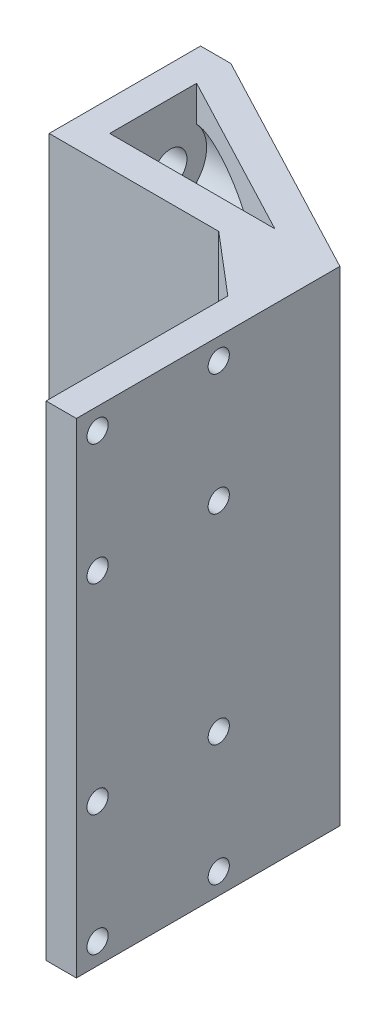
ISO-10303-21;
HEADER;
FILE_DESCRIPTION(('STEP AP214'),'2;1');
FILE_NAME('part.step','',(''),(''),'','','');
FILE_SCHEMA(('AUTOMOTIVE_DESIGN { 1 0 10303 214 1 1 1 1 }'));
ENDSEC;
DATA;
#1=APPLICATION_CONTEXT('core data for automotive mechanical design processes');
#2=APPLICATION_PROTOCOL_DEFINITION('international standard','automotive_design',2000,#1);
#3=PRODUCT_CONTEXT('',#1,'mechanical');
#4=PRODUCT('Part','Part','',(#3));
#5=PRODUCT_RELATED_PRODUCT_CATEGORY('part','',(#4));
#6=PRODUCT_DEFINITION_FORMATION('','',#4);
#7=PRODUCT_DEFINITION_CONTEXT('part definition',#1,'design');
#8=PRODUCT_DEFINITION('design','',#6,#7);
#9=PRODUCT_DEFINITION_SHAPE('','',#8);
#10=(LENGTH_UNIT() NAMED_UNIT(*) SI_UNIT(.MILLI.,.METRE.));
#11=(NAMED_UNIT(*) PLANE_ANGLE_UNIT() SI_UNIT($,.RADIAN.));
#12=(NAMED_UNIT(*) SI_UNIT($,.STERADIAN.) SOLID_ANGLE_UNIT());
#13=UNCERTAINTY_MEASURE_WITH_UNIT(LENGTH_MEASURE(1.E-05),#10,'distance_accuracy_value','');
#14=(GEOMETRIC_REPRESENTATION_CONTEXT(3) GLOBAL_UNCERTAINTY_ASSIGNED_CONTEXT((#13)) GLOBAL_UNIT_ASSIGNED_CONTEXT((#10,
#11,#12)) REPRESENTATION_CONTEXT('',''));
#15=CARTESIAN_POINT('',(0.,0.,0.));
#16=DIRECTION('',(0.,0.,1.));
#17=DIRECTION('',(1.,0.,0.));
#18=AXIS2_PLACEMENT_3D('',#15,#16,#17);
#19=CARTESIAN_POINT('',(-28.3968723584108,-98.5901727555194,-14.3497603806358));
#20=DIRECTION('',(-0.465746432832622,0.,0.884918222381982));
#21=DIRECTION('',(0.884918222381982,0.,0.465746432832622));
#22=AXIS2_PLACEMENT_3D('',#19,#20,#21);
#23=PLANE('',#22);
#24=DIRECTION('',(0.,1.,0.));
#25=VECTOR('',#24,1.);
#26=CARTESIAN_POINT('',(-28.3968723584108,-98.5901727555194,-14.3497603806358));
#27=LINE('',#26,#25);
#28=CARTESIAN_POINT('',(-28.3968723584108,-41.5156062374836,-14.3497603806358));
#29=VERTEX_POINT('',#28);
#30=CARTESIAN_POINT('',(-28.3968723584108,-29.7810970592197,-14.3497603806358));
#31=VERTEX_POINT('',#30);
#32=EDGE_CURVE('E163',#29,#31,#27,.T.);
#33=ORIENTED_EDGE('',*,*,#32,.F.);
#34=CARTESIAN_POINT('',(-20.1323276352027,-45.6483516483516,-10.));
#35=DIRECTION('',(-0.465746432832622,0.,0.884918222381982));
#36=DIRECTION('',(-0.884918222381983,0.,-0.465746432832622));
#37=AXIS2_PLACEMENT_3D('',#34,#35,#36);
#38=ELLIPSE('',#37,12.8825463321503,6.);
#39=CARTESIAN_POINT('',(-28.3968723584108,-49.7810970592197,-14.3497603806358));
#40=VERTEX_POINT('',#39);
#41=EDGE_CURVE('E150',#40,#29,#38,.T.);
#42=ORIENTED_EDGE('',*,*,#41,.F.);
#43=CARTESIAN_POINT('',(-28.3968723584108,-55.6483516483516,-14.3497603806358));
#44=VERTEX_POINT('',#43);
#45=EDGE_CURVE('E160',#44,#40,#27,.T.);
#46=ORIENTED_EDGE('',*,*,#45,.F.);
#47=DIRECTION('',(-0.884918222381982,0.,-0.465746432832622));
#48=VECTOR('',#47,1.);
#49=CARTESIAN_POINT('',(-28.3968723584108,-55.6483516483516,-14.3497603806358));
#50=LINE('',#49,#48);
#51=CARTESIAN_POINT('',(-1.13232763520272,-55.6483516483516,0.));
#52=VERTEX_POINT('',#51);
#53=EDGE_CURVE('E177',#52,#44,#50,.T.);
#54=ORIENTED_EDGE('',*,*,#53,.F.);
#55=DIRECTION('',(0.,1.,0.));
#56=VECTOR('',#55,1.);
#57=CARTESIAN_POINT('',(-1.13232763520273,-98.5901727555194,0.));
#58=LINE('',#57,#56);
#59=CARTESIAN_POINT('',(-1.13232763520274,24.3516483516484,0.));
#60=VERTEX_POINT('',#59);
#61=EDGE_CURVE('E171',#52,#60,#58,.T.);
#62=ORIENTED_EDGE('',*,*,#61,.T.);
#63=DIRECTION('',(0.884918222381982,0.,0.465746432832622));
#64=VECTOR('',#63,1.);
#65=CARTESIAN_POINT('',(-28.3968723584108,24.3516483516484,-14.3497603806358));
#66=LINE('',#65,#64);
#67=CARTESIAN_POINT('',(-28.3968723584108,24.3516483516484,-14.3497603806358));
#68=VERTEX_POINT('',#67);
#69=EDGE_CURVE('E183',#68,#60,#66,.T.);
#70=ORIENTED_EDGE('',*,*,#69,.F.);
#71=CARTESIAN_POINT('',(-28.3968723584108,18.4843937625164,-14.3497603806358));
#72=VERTEX_POINT('',#71);
#73=EDGE_CURVE('E173',#72,#68,#27,.T.);
#74=ORIENTED_EDGE('',*,*,#73,.F.);
#75=CARTESIAN_POINT('',(-20.1323276352027,14.3516483516484,-10.));
#76=DIRECTION('',(-0.465746432832622,0.,0.884918222381982));
#77=DIRECTION('',(-0.884918222381983,0.,-0.465746432832622));
#78=AXIS2_PLACEMENT_3D('',#75,#76,#77);
#79=ELLIPSE('',#78,12.8825463321503,6.);
#80=CARTESIAN_POINT('',(-28.3968723584108,10.2189029407803,-14.3497603806358));
#81=VERTEX_POINT('',#80);
#82=EDGE_CURVE('E210',#81,#72,#79,.T.);
#83=ORIENTED_EDGE('',*,*,#82,.F.);
#84=CARTESIAN_POINT('',(-28.3968723584108,-1.51560623748359,-14.3497603806358));
#85=VERTEX_POINT('',#84);
#86=EDGE_CURVE('E182',#85,#81,#27,.T.);
#87=ORIENTED_EDGE('',*,*,#86,.F.);
#88=CARTESIAN_POINT('',(-20.1323276352027,-5.64835164835165,-10.));
#89=DIRECTION('',(-0.465746432832622,0.,0.884918222381982));
#90=DIRECTION('',(-0.884918222381983,0.,-0.465746432832622));
#91=AXIS2_PLACEMENT_3D('',#88,#89,#90);
#92=ELLIPSE('',#91,12.8825463321503,6.);
#93=CARTESIAN_POINT('',(-28.3968723584108,-9.7810970592197,-14.3497603806358));
#94=VERTEX_POINT('',#93);
#95=EDGE_CURVE('E206',#94,#85,#92,.T.);
#96=ORIENTED_EDGE('',*,*,#95,.F.);
#97=CARTESIAN_POINT('',(-28.3968723584108,-21.5156062374836,-14.3497603806358));
#98=VERTEX_POINT('',#97);
#99=EDGE_CURVE('E179',#98,#94,#27,.T.);
#100=ORIENTED_EDGE('',*,*,#99,.F.);
#101=CARTESIAN_POINT('',(-20.1323276352027,-25.6483516483516,-10.));
#102=DIRECTION('',(-0.465746432832622,0.,0.884918222381982));
#103=DIRECTION('',(-0.884918222381983,0.,-0.465746432832622));
#104=AXIS2_PLACEMENT_3D('',#101,#102,#103);
#105=ELLIPSE('',#104,12.8825463321503,6.);
#106=EDGE_CURVE('E217',#31,#98,#105,.T.);
#107=ORIENTED_EDGE('',*,*,#106,.F.);
#108=EDGE_LOOP('',(#33,#42,#46,#54,#62,#70,#74,#83,#87,#96,#100,#107));
#109=FACE_BOUND('',#108,.T.);
#110=ADVANCED_FACE('F41',(#109),#23,.T.);
#111=CARTESIAN_POINT('',(0.,0.,0.));
#112=DIRECTION('',(0.,0.,1.));
#113=DIRECTION('',(1.,0.,0.));
#114=AXIS2_PLACEMENT_3D('',#111,#112,#113);
#115=PLANE('',#114);
#116=CARTESIAN_POINT('',(-18.3968723584108,-45.6483516483517,0.));
#117=DIRECTION('',(0.,0.,-1.));
#118=DIRECTION('',(-1.,0.,0.));
#119=AXIS2_PLACEMENT_3D('',#116,#117,#118);
#120=CIRCLE('',#119,1.5);
#121=CARTESIAN_POINT('',(-19.8968723584108,-45.6483516483517,0.));
#122=VERTEX_POINT('',#121);
#123=EDGE_CURVE('E434',#122,#122,#120,.T.);
#124=ORIENTED_EDGE('',*,*,#123,.F.);
#125=EDGE_LOOP('',(#124));
#126=FACE_BOUND('',#125,.T.);
#127=DIRECTION('',(-1.,0.,0.));
#128=VECTOR('',#127,1.);
#129=CARTESIAN_POINT('',(-33.3968723584108,24.3516483516484,0.));
#130=LINE('',#129,#128);
#131=CARTESIAN_POINT('',(-28.3968723584108,24.3516483516484,0.));
#132=VERTEX_POINT('',#131);
#133=EDGE_CURVE('E379',#60,#132,#130,.T.);
#134=ORIENTED_EDGE('',*,*,#133,.F.);
#135=ORIENTED_EDGE('',*,*,#61,.F.);
#136=DIRECTION('',(1.,0.,0.));
#137=VECTOR('',#136,1.);
#138=CARTESIAN_POINT('',(-33.3968723584108,-55.6483516483516,0.));
#139=LINE('',#138,#137);
#140=CARTESIAN_POINT('',(-28.3968723584108,-55.6483516483516,0.));
#141=VERTEX_POINT('',#140);
#142=EDGE_CURVE('E371',#141,#52,#139,.T.);
#143=ORIENTED_EDGE('',*,*,#142,.F.);
#144=DIRECTION('',(0.,-1.,0.));
#145=VECTOR('',#144,1.);
#146=CARTESIAN_POINT('',(-28.3968723584108,-55.6483516483516,0.));
#147=LINE('',#146,#145);
#148=EDGE_CURVE('E280',#132,#141,#147,.T.);
#149=ORIENTED_EDGE('',*,*,#148,.F.);
#150=EDGE_LOOP('',(#134,#135,#143,#149));
#151=FACE_BOUND('',#150,.T.);
#152=ADVANCED_FACE('F465',(#126,#151),#115,.F.);
#153=CARTESIAN_POINT('',(0.,0.,5.));
#154=DIRECTION('',(0.,0.,1.));
#155=DIRECTION('',(1.,0.,0.));
#156=AXIS2_PLACEMENT_3D('',#153,#154,#155);
#157=PLANE('',#156);
#158=CARTESIAN_POINT('',(-18.3968723584108,-45.6483516483517,5.));
#159=DIRECTION('',(0.,0.,1.));
#160=DIRECTION('',(1.,0.,0.));
#161=AXIS2_PLACEMENT_3D('',#158,#159,#160);
#162=CIRCLE('',#161,1.5);
#163=CARTESIAN_POINT('',(-16.8968723584108,-45.6483516483517,5.));
#164=VERTEX_POINT('',#163);
#165=EDGE_CURVE('E258',#164,#164,#162,.F.);
#166=ORIENTED_EDGE('',*,*,#165,.T.);
#167=EDGE_LOOP('',(#166));
#168=FACE_BOUND('',#167,.T.);
#169=DIRECTION('',(1.,0.,0.));
#170=VECTOR('',#169,1.);
#171=CARTESIAN_POINT('',(-33.3968723584108,-55.6483516483516,5.));
#172=LINE('',#171,#170);
#173=CARTESIAN_POINT('',(-33.3968723584108,-55.6483516483516,5.));
#174=VERTEX_POINT('',#173);
#175=CARTESIAN_POINT('',(-5.39687235841076,-55.6483516483516,5.));
#176=VERTEX_POINT('',#175);
#177=EDGE_CURVE('E378',#174,#176,#172,.T.);
#178=ORIENTED_EDGE('',*,*,#177,.T.);
#179=DIRECTION('',(0.,1.,0.));
#180=VECTOR('',#179,1.);
#181=CARTESIAN_POINT('',(-5.39687235841076,24.3516483516484,5.));
#182=LINE('',#181,#180);
#183=CARTESIAN_POINT('',(-5.39687235841076,24.3516483516484,5.));
#184=VERTEX_POINT('',#183);
#185=EDGE_CURVE('E405',#176,#184,#182,.T.);
#186=ORIENTED_EDGE('',*,*,#185,.T.);
#187=DIRECTION('',(-1.,0.,0.));
#188=VECTOR('',#187,1.);
#189=CARTESIAN_POINT('',(-33.3968723584108,24.3516483516484,5.));
#190=LINE('',#189,#188);
#191=CARTESIAN_POINT('',(-33.3968723584108,24.3516483516484,5.));
#192=VERTEX_POINT('',#191);
#193=EDGE_CURVE('E383',#184,#192,#190,.T.);
#194=ORIENTED_EDGE('',*,*,#193,.T.);
#195=DIRECTION('',(0.,-1.,0.));
#196=VECTOR('',#195,1.);
#197=CARTESIAN_POINT('',(-33.3968723584108,24.3516483516484,5.));
#198=LINE('',#197,#196);
#199=EDGE_CURVE('E374',#192,#174,#198,.T.);
#200=ORIENTED_EDGE('',*,*,#199,.T.);
#201=EDGE_LOOP('',(#178,#186,#194,#200));
#202=FACE_BOUND('',#201,.T.);
#203=ADVANCED_FACE('F413',(#168,#202),#157,.T.);
#204=CARTESIAN_POINT('',(-33.3968723584108,24.3516483516484,5.));
#205=DIRECTION('',(1.,0.,0.));
#206=DIRECTION('',(0.,0.,-1.));
#207=AXIS2_PLACEMENT_3D('',#204,#205,#206);
#208=PLANE('',#207);
#209=CARTESIAN_POINT('',(-33.3968723584108,14.3516483516484,-10.));
#210=DIRECTION('',(1.,0.,0.));
#211=DIRECTION('',(0.,0.,-1.));
#212=AXIS2_PLACEMENT_3D('',#209,#210,#211);
#213=CIRCLE('',#212,2.75);
#214=CARTESIAN_POINT('',(-33.3968723584108,14.3516483516484,-12.75));
#215=VERTEX_POINT('',#214);
#216=EDGE_CURVE('E283',#215,#215,#213,.F.);
#217=ORIENTED_EDGE('',*,*,#216,.F.);
#218=EDGE_LOOP('',(#217));
#219=FACE_BOUND('',#218,.T.);
#220=CARTESIAN_POINT('',(-33.3968723584108,-5.64835164835165,-10.));
#221=DIRECTION('',(1.,0.,0.));
#222=DIRECTION('',(0.,0.,-1.));
#223=AXIS2_PLACEMENT_3D('',#220,#221,#222);
#224=CIRCLE('',#223,2.75);
#225=CARTESIAN_POINT('',(-33.3968723584108,-5.64835164835165,-12.75));
#226=VERTEX_POINT('',#225);
#227=EDGE_CURVE('E443',#226,#226,#224,.F.);
#228=ORIENTED_EDGE('',*,*,#227,.F.);
#229=EDGE_LOOP('',(#228));
#230=FACE_BOUND('',#229,.T.);
#231=CARTESIAN_POINT('',(-33.3968723584108,-25.6483516483516,-10.));
#232=DIRECTION('',(1.,0.,0.));
#233=DIRECTION('',(0.,0.,-1.));
#234=AXIS2_PLACEMENT_3D('',#231,#232,#233);
#235=CIRCLE('',#234,2.75);
#236=CARTESIAN_POINT('',(-33.3968723584108,-25.6483516483516,-12.75));
#237=VERTEX_POINT('',#236);
#238=EDGE_CURVE('E435',#237,#237,#235,.F.);
#239=ORIENTED_EDGE('',*,*,#238,.F.);
#240=EDGE_LOOP('',(#239));
#241=FACE_BOUND('',#240,.T.);
#242=CARTESIAN_POINT('',(-33.3968723584108,-45.6483516483516,-10.));
#243=DIRECTION('',(1.,0.,0.));
#244=DIRECTION('',(0.,0.,-1.));
#245=AXIS2_PLACEMENT_3D('',#242,#243,#244);
#246=CIRCLE('',#245,2.75);
#247=CARTESIAN_POINT('',(-33.3968723584108,-45.6483516483516,-12.75));
#248=VERTEX_POINT('',#247);
#249=EDGE_CURVE('E425',#248,#248,#246,.F.);
#250=ORIENTED_EDGE('',*,*,#249,.F.);
#251=EDGE_LOOP('',(#250));
#252=FACE_BOUND('',#251,.T.);
#253=DIRECTION('',(0.,0.,-1.));
#254=VECTOR('',#253,1.);
#255=CARTESIAN_POINT('',(-33.3968723584108,24.3516483516484,5.));
#256=LINE('',#255,#254);
#257=CARTESIAN_POINT('',(-33.3968723584108,24.3516483516484,-20.));
#258=VERTEX_POINT('',#257);
#259=EDGE_CURVE('E386',#192,#258,#256,.T.);
#260=ORIENTED_EDGE('',*,*,#259,.T.);
#261=DIRECTION('',(0.,1.,0.));
#262=VECTOR('',#261,1.);
#263=CARTESIAN_POINT('',(-33.3968723584108,-55.6483516483516,-20.));
#264=LINE('',#263,#262);
#265=CARTESIAN_POINT('',(-33.3968723584108,-55.6483516483516,-20.));
#266=VERTEX_POINT('',#265);
#267=EDGE_CURVE('E282',#266,#258,#264,.T.);
#268=ORIENTED_EDGE('',*,*,#267,.F.);
#269=DIRECTION('',(0.,0.,-1.));
#270=VECTOR('',#269,1.);
#271=CARTESIAN_POINT('',(-33.3968723584108,-55.6483516483516,5.));
#272=LINE('',#271,#270);
#273=EDGE_CURVE('E272',#174,#266,#272,.T.);
#274=ORIENTED_EDGE('',*,*,#273,.F.);
#275=ORIENTED_EDGE('',*,*,#199,.F.);
#276=EDGE_LOOP('',(#260,#268,#274,#275));
#277=FACE_BOUND('',#276,.T.);
#278=ADVANCED_FACE('F420',(#219,#230,#241,#252,#277),#208,.F.);
#279=CARTESIAN_POINT('',(-33.3968723584108,-55.6483516483516,5.));
#280=DIRECTION('',(0.,1.,0.));
#281=DIRECTION('',(0.,0.,1.));
#282=AXIS2_PLACEMENT_3D('',#279,#280,#281);
#283=PLANE('',#282);
#284=ORIENTED_EDGE('',*,*,#142,.T.);
#285=ORIENTED_EDGE('',*,*,#53,.T.);
#286=DIRECTION('',(0.,0.,1.));
#287=VECTOR('',#286,1.);
#288=CARTESIAN_POINT('',(-28.3968723584108,-55.6483516483516,-20.));
#289=LINE('',#288,#287);
#290=EDGE_CURVE('E169',#44,#141,#289,.T.);
#291=ORIENTED_EDGE('',*,*,#290,.T.);
#292=EDGE_LOOP('',(#284,#285,#291));
#293=FACE_BOUND('',#292,.T.);
#294=ORIENTED_EDGE('',*,*,#273,.T.);
#295=DIRECTION('',(-1.,0.,0.));
#296=VECTOR('',#295,1.);
#297=CARTESIAN_POINT('',(-33.3968723584108,-55.6483516483516,-20.));
#298=LINE('',#297,#296);
#299=CARTESIAN_POINT('',(-28.3968723584108,-55.6483516483516,-20.));
#300=VERTEX_POINT('',#299);
#301=EDGE_CURVE('E264',#300,#266,#298,.T.);
#302=ORIENTED_EDGE('',*,*,#301,.F.);
#303=DIRECTION('',(0.884918222381982,0.,0.465746432832623));
#304=VECTOR('',#303,1.);
#305=CARTESIAN_POINT('',(9.6031276415892,-55.6483516483516,0.));
#306=LINE('',#305,#304);
#307=CARTESIAN_POINT('',(9.6031276415892,-55.6483516483516,0.));
#308=VERTEX_POINT('',#307);
#309=EDGE_CURVE('E201',#300,#308,#306,.T.);
#310=ORIENTED_EDGE('',*,*,#309,.T.);
#311=DIRECTION('',(0.,0.,-1.));
#312=VECTOR('',#311,1.);
#313=CARTESIAN_POINT('',(9.60312764158921,-55.6483516483516,5.));
#314=LINE('',#313,#312);
#315=CARTESIAN_POINT('',(9.60312764158921,-55.6483516483516,43.5));
#316=VERTEX_POINT('',#315);
#317=EDGE_CURVE('E400',#316,#308,#314,.T.);
#318=ORIENTED_EDGE('',*,*,#317,.F.);
#319=DIRECTION('',(-1.,0.,0.));
#320=VECTOR('',#319,1.);
#321=CARTESIAN_POINT('',(9.60312764158921,-55.6483516483516,43.5));
#322=LINE('',#321,#320);
#323=CARTESIAN_POINT('',(4.60312764158921,-55.6483516483516,43.5));
#324=VERTEX_POINT('',#323);
#325=EDGE_CURVE('E355',#316,#324,#322,.T.);
#326=ORIENTED_EDGE('',*,*,#325,.T.);
#327=DIRECTION('',(0.,0.,-1.));
#328=VECTOR('',#327,1.);
#329=CARTESIAN_POINT('',(4.60312764158921,-55.6483516483516,43.5));
#330=LINE('',#329,#328);
#331=CARTESIAN_POINT('',(4.60312764158921,-55.6483516483516,13.5));
#332=VERTEX_POINT('',#331);
#333=EDGE_CURVE('E367',#324,#332,#330,.T.);
#334=ORIENTED_EDGE('',*,*,#333,.T.);
#335=DIRECTION('',(0.761939317759459,0.,0.647648420095541));
#336=VECTOR('',#335,1.);
#337=CARTESIAN_POINT('',(-21.6523150289478,-55.6483516483516,-8.81712626995648));
#338=LINE('',#337,#336);
#339=EDGE_CURVE('E11',#332,#176,#338,.F.);
#340=ORIENTED_EDGE('',*,*,#339,.T.);
#341=ORIENTED_EDGE('',*,*,#177,.F.);
#342=EDGE_LOOP('',(#294,#302,#310,#318,#326,#334,#340,#341));
#343=FACE_BOUND('',#342,.T.);
#344=ADVANCED_FACE('F270',(#293,#343),#283,.F.);
#345=CARTESIAN_POINT('',(9.6031276415892,24.3516483516484,5.));
#346=DIRECTION('',(-1.,0.,0.));
#347=DIRECTION('',(0.,-1.,0.));
#348=AXIS2_PLACEMENT_3D('',#345,#346,#347);
#349=PLANE('',#348);
#350=CARTESIAN_POINT('',(9.6031276415892,0.851648351648354,40.));
#351=DIRECTION('',(1.,0.,0.));
#352=DIRECTION('',(0.,1.,0.));
#353=AXIS2_PLACEMENT_3D('',#350,#351,#352);
#354=CIRCLE('',#353,1.75);
#355=CARTESIAN_POINT('',(9.6031276415892,2.60164835164836,40.));
#356=VERTEX_POINT('',#355);
#357=EDGE_CURVE('E321',#356,#356,#354,.T.);
#358=ORIENTED_EDGE('',*,*,#357,.F.);
#359=EDGE_LOOP('',(#358));
#360=FACE_BOUND('',#359,.T.);
#361=CARTESIAN_POINT('',(9.60312764158921,-52.1483516483516,20.));
#362=DIRECTION('',(1.,0.,0.));
#363=DIRECTION('',(0.,1.,0.));
#364=AXIS2_PLACEMENT_3D('',#361,#362,#363);
#365=CIRCLE('',#364,1.75);
#366=CARTESIAN_POINT('',(9.60312764158921,-50.3983516483516,20.));
#367=VERTEX_POINT('',#366);
#368=EDGE_CURVE('E312',#367,#367,#365,.T.);
#369=ORIENTED_EDGE('',*,*,#368,.F.);
#370=EDGE_LOOP('',(#369));
#371=FACE_BOUND('',#370,.T.);
#372=CARTESIAN_POINT('',(9.60312764158921,-32.1483516483516,20.));
#373=DIRECTION('',(1.,0.,0.));
#374=DIRECTION('',(0.,1.,0.));
#375=AXIS2_PLACEMENT_3D('',#372,#373,#374);
#376=CIRCLE('',#375,1.75);
#377=CARTESIAN_POINT('',(9.60312764158921,-30.3983516483516,20.));
#378=VERTEX_POINT('',#377);
#379=EDGE_CURVE('E337',#378,#378,#376,.T.);
#380=ORIENTED_EDGE('',*,*,#379,.F.);
#381=EDGE_LOOP('',(#380));
#382=FACE_BOUND('',#381,.T.);
#383=CARTESIAN_POINT('',(9.60312764158921,-32.1483516483516,40.));
#384=DIRECTION('',(1.,0.,0.));
#385=DIRECTION('',(0.,1.,0.));
#386=AXIS2_PLACEMENT_3D('',#383,#384,#385);
#387=CIRCLE('',#386,1.75);
#388=CARTESIAN_POINT('',(9.60312764158921,-30.3983516483516,40.));
#389=VERTEX_POINT('',#388);
#390=EDGE_CURVE('E328',#389,#389,#387,.T.);
#391=ORIENTED_EDGE('',*,*,#390,.F.);
#392=EDGE_LOOP('',(#391));
#393=FACE_BOUND('',#392,.T.);
#394=CARTESIAN_POINT('',(9.6031276415892,20.8516483516484,40.));
#395=DIRECTION('',(1.,0.,0.));
#396=DIRECTION('',(0.,1.,0.));
#397=AXIS2_PLACEMENT_3D('',#394,#395,#396);
#398=CIRCLE('',#397,1.75);
#399=CARTESIAN_POINT('',(9.6031276415892,22.6016483516484,40.));
#400=VERTEX_POINT('',#399);
#401=EDGE_CURVE('E288',#400,#400,#398,.T.);
#402=ORIENTED_EDGE('',*,*,#401,.F.);
#403=EDGE_LOOP('',(#402));
#404=FACE_BOUND('',#403,.T.);
#405=CARTESIAN_POINT('',(9.6031276415892,20.8516483516484,20.));
#406=DIRECTION('',(1.,0.,0.));
#407=DIRECTION('',(0.,1.,0.));
#408=AXIS2_PLACEMENT_3D('',#405,#406,#407);
#409=CIRCLE('',#408,1.75);
#410=CARTESIAN_POINT('',(9.6031276415892,22.6016483516484,20.));
#411=VERTEX_POINT('',#410);
#412=EDGE_CURVE('E297',#411,#411,#409,.T.);
#413=ORIENTED_EDGE('',*,*,#412,.F.);
#414=EDGE_LOOP('',(#413));
#415=FACE_BOUND('',#414,.T.);
#416=CARTESIAN_POINT('',(9.6031276415892,0.851648351648354,20.));
#417=DIRECTION('',(1.,0.,0.));
#418=DIRECTION('',(0.,1.,0.));
#419=AXIS2_PLACEMENT_3D('',#416,#417,#418);
#420=CIRCLE('',#419,1.75);
#421=CARTESIAN_POINT('',(9.6031276415892,2.60164835164835,20.));
#422=VERTEX_POINT('',#421);
#423=EDGE_CURVE('E305',#422,#422,#420,.T.);
#424=ORIENTED_EDGE('',*,*,#423,.F.);
#425=EDGE_LOOP('',(#424));
#426=FACE_BOUND('',#425,.T.);
#427=CARTESIAN_POINT('',(9.60312764158921,-52.1483516483516,40.));
#428=DIRECTION('',(1.,0.,0.));
#429=DIRECTION('',(0.,1.,0.));
#430=AXIS2_PLACEMENT_3D('',#427,#428,#429);
#431=CIRCLE('',#430,1.75);
#432=CARTESIAN_POINT('',(9.60312764158921,-50.3983516483516,40.));
#433=VERTEX_POINT('',#432);
#434=EDGE_CURVE('E344',#433,#433,#431,.T.);
#435=ORIENTED_EDGE('',*,*,#434,.F.);
#436=EDGE_LOOP('',(#435));
#437=FACE_BOUND('',#436,.T.);
#438=DIRECTION('',(0.,1.,0.));
#439=VECTOR('',#438,1.);
#440=CARTESIAN_POINT('',(9.6031276415892,24.3516483516484,0.));
#441=LINE('',#440,#439);
#442=CARTESIAN_POINT('',(9.6031276415892,24.3516483516484,0.));
#443=VERTEX_POINT('',#442);
#444=EDGE_CURVE('E253',#308,#443,#441,.T.);
#445=ORIENTED_EDGE('',*,*,#444,.T.);
#446=DIRECTION('',(0.,0.,-1.));
#447=VECTOR('',#446,1.);
#448=CARTESIAN_POINT('',(9.6031276415892,24.3516483516484,5.));
#449=LINE('',#448,#447);
#450=CARTESIAN_POINT('',(9.60312764158921,24.3516483516484,43.5));
#451=VERTEX_POINT('',#450);
#452=EDGE_CURVE('E396',#451,#443,#449,.T.);
#453=ORIENTED_EDGE('',*,*,#452,.F.);
#454=DIRECTION('',(0.,-1.,0.));
#455=VECTOR('',#454,1.);
#456=CARTESIAN_POINT('',(9.60312764158921,-55.6483516483516,43.5));
#457=LINE('',#456,#455);
#458=EDGE_CURVE('E348',#451,#316,#457,.T.);
#459=ORIENTED_EDGE('',*,*,#458,.T.);
#460=ORIENTED_EDGE('',*,*,#317,.T.);
#461=EDGE_LOOP('',(#445,#453,#459,#460));
#462=FACE_BOUND('',#461,.T.);
#463=ADVANCED_FACE('F475',(#360,#371,#382,#393,#404,#415,#426,#437,#462),#349,.F.);
#464=CARTESIAN_POINT('',(-33.3968723584108,24.3516483516484,5.));
#465=DIRECTION('',(0.,-1.,0.));
#466=DIRECTION('',(0.,0.,-1.));
#467=AXIS2_PLACEMENT_3D('',#464,#465,#466);
#468=PLANE('',#467);
#469=ORIENTED_EDGE('',*,*,#69,.T.);
#470=ORIENTED_EDGE('',*,*,#133,.T.);
#471=DIRECTION('',(0.,0.,1.));
#472=VECTOR('',#471,1.);
#473=CARTESIAN_POINT('',(-28.3968723584108,24.3516483516484,-20.));
#474=LINE('',#473,#472);
#475=EDGE_CURVE('E276',#68,#132,#474,.T.);
#476=ORIENTED_EDGE('',*,*,#475,.F.);
#477=EDGE_LOOP('',(#469,#470,#476));
#478=FACE_BOUND('',#477,.T.);
#479=ORIENTED_EDGE('',*,*,#452,.T.);
#480=DIRECTION('',(-0.884918222381982,0.,-0.465746432832622));
#481=VECTOR('',#480,1.);
#482=CARTESIAN_POINT('',(9.6031276415892,24.3516483516484,0.));
#483=LINE('',#482,#481);
#484=CARTESIAN_POINT('',(-28.3968723584108,24.3516483516484,-20.));
#485=VERTEX_POINT('',#484);
#486=EDGE_CURVE('E191',#443,#485,#483,.T.);
#487=ORIENTED_EDGE('',*,*,#486,.T.);
#488=DIRECTION('',(1.,0.,0.));
#489=VECTOR('',#488,1.);
#490=CARTESIAN_POINT('',(-33.3968723584108,24.3516483516484,-20.));
#491=LINE('',#490,#489);
#492=EDGE_CURVE('E267',#258,#485,#491,.T.);
#493=ORIENTED_EDGE('',*,*,#492,.F.);
#494=ORIENTED_EDGE('',*,*,#259,.F.);
#495=ORIENTED_EDGE('',*,*,#193,.F.);
#496=DIRECTION('',(-0.761939317759459,0.,-0.647648420095541));
#497=VECTOR('',#496,1.);
#498=CARTESIAN_POINT('',(-21.6523150289478,24.3516483516484,-8.81712626995648));
#499=LINE('',#498,#497);
#500=CARTESIAN_POINT('',(4.60312764158921,24.3516483516484,13.5));
#501=VERTEX_POINT('',#500);
#502=EDGE_CURVE('E50',#184,#501,#499,.F.);
#503=ORIENTED_EDGE('',*,*,#502,.T.);
#504=DIRECTION('',(0.,0.,-1.));
#505=VECTOR('',#504,1.);
#506=CARTESIAN_POINT('',(4.60312764158921,24.3516483516484,43.5));
#507=LINE('',#506,#505);
#508=CARTESIAN_POINT('',(4.60312764158921,24.3516483516484,43.5));
#509=VERTEX_POINT('',#508);
#510=EDGE_CURVE('E368',#509,#501,#507,.T.);
#511=ORIENTED_EDGE('',*,*,#510,.F.);
#512=DIRECTION('',(1.,0.,0.));
#513=VECTOR('',#512,1.);
#514=CARTESIAN_POINT('',(9.60312764158921,24.3516483516484,43.5));
#515=LINE('',#514,#513);
#516=EDGE_CURVE('E363',#509,#451,#515,.T.);
#517=ORIENTED_EDGE('',*,*,#516,.T.);
#518=EDGE_LOOP('',(#479,#487,#493,#494,#495,#503,#511,#517));
#519=FACE_BOUND('',#518,.T.);
#520=ADVANCED_FACE('F417',(#478,#519),#468,.F.);
#521=CARTESIAN_POINT('',(4.60312764158921,-55.6483516483516,43.5));
#522=DIRECTION('',(-1.,0.,0.));
#523=DIRECTION('',(0.,0.,1.));
#524=AXIS2_PLACEMENT_3D('',#521,#522,#523);
#525=PLANE('',#524);
#526=CARTESIAN_POINT('',(4.6031276415892,0.851648351648353,40.));
#527=DIRECTION('',(-1.,0.,0.));
#528=DIRECTION('',(0.,0.,1.));
#529=AXIS2_PLACEMENT_3D('',#526,#527,#528);
#530=CIRCLE('',#529,1.75);
#531=CARTESIAN_POINT('',(4.6031276415892,0.851648351648353,41.75));
#532=VERTEX_POINT('',#531);
#533=EDGE_CURVE('E292',#532,#532,#530,.F.);
#534=ORIENTED_EDGE('',*,*,#533,.T.);
#535=EDGE_LOOP('',(#534));
#536=FACE_BOUND('',#535,.T.);
#537=CARTESIAN_POINT('',(4.60312764158921,-52.1483516483516,20.));
#538=DIRECTION('',(-1.,0.,0.));
#539=DIRECTION('',(0.,0.,1.));
#540=AXIS2_PLACEMENT_3D('',#537,#538,#539);
#541=CIRCLE('',#540,1.75);
#542=CARTESIAN_POINT('',(4.60312764158921,-52.1483516483516,21.75));
#543=VERTEX_POINT('',#542);
#544=EDGE_CURVE('E317',#543,#543,#541,.F.);
#545=ORIENTED_EDGE('',*,*,#544,.T.);
#546=EDGE_LOOP('',(#545));
#547=FACE_BOUND('',#546,.T.);
#548=CARTESIAN_POINT('',(4.60312764158921,-32.1483516483516,20.));
#549=DIRECTION('',(-1.,0.,0.));
#550=DIRECTION('',(0.,0.,1.));
#551=AXIS2_PLACEMENT_3D('',#548,#549,#550);
#552=CIRCLE('',#551,1.75);
#553=CARTESIAN_POINT('',(4.60312764158921,-32.1483516483516,21.75));
#554=VERTEX_POINT('',#553);
#555=EDGE_CURVE('E316',#554,#554,#552,.F.);
#556=ORIENTED_EDGE('',*,*,#555,.T.);
#557=EDGE_LOOP('',(#556));
#558=FACE_BOUND('',#557,.T.);
#559=CARTESIAN_POINT('',(4.60312764158921,-32.1483516483516,40.));
#560=DIRECTION('',(-1.,0.,0.));
#561=DIRECTION('',(0.,0.,1.));
#562=AXIS2_PLACEMENT_3D('',#559,#560,#561);
#563=CIRCLE('',#562,1.75);
#564=CARTESIAN_POINT('',(4.60312764158921,-32.1483516483516,41.75));
#565=VERTEX_POINT('',#564);
#566=EDGE_CURVE('E333',#565,#565,#563,.F.);
#567=ORIENTED_EDGE('',*,*,#566,.T.);
#568=EDGE_LOOP('',(#567));
#569=FACE_BOUND('',#568,.T.);
#570=CARTESIAN_POINT('',(4.6031276415892,20.8516483516484,40.));
#571=DIRECTION('',(-1.,0.,0.));
#572=DIRECTION('',(0.,0.,1.));
#573=AXIS2_PLACEMENT_3D('',#570,#571,#572);
#574=CIRCLE('',#573,1.75);
#575=CARTESIAN_POINT('',(4.6031276415892,20.8516483516484,41.75));
#576=VERTEX_POINT('',#575);
#577=EDGE_CURVE('E293',#576,#576,#574,.F.);
#578=ORIENTED_EDGE('',*,*,#577,.T.);
#579=EDGE_LOOP('',(#578));
#580=FACE_BOUND('',#579,.T.);
#581=CARTESIAN_POINT('',(4.6031276415892,20.8516483516484,20.));
#582=DIRECTION('',(-1.,0.,0.));
#583=DIRECTION('',(0.,0.,1.));
#584=AXIS2_PLACEMENT_3D('',#581,#582,#583);
#585=CIRCLE('',#584,1.75);
#586=CARTESIAN_POINT('',(4.6031276415892,20.8516483516484,21.75));
#587=VERTEX_POINT('',#586);
#588=EDGE_CURVE('E301',#587,#587,#585,.F.);
#589=ORIENTED_EDGE('',*,*,#588,.T.);
#590=EDGE_LOOP('',(#589));
#591=FACE_BOUND('',#590,.T.);
#592=CARTESIAN_POINT('',(4.6031276415892,0.851648351648353,20.));
#593=DIRECTION('',(-1.,0.,0.));
#594=DIRECTION('',(0.,0.,1.));
#595=AXIS2_PLACEMENT_3D('',#592,#593,#594);
#596=CIRCLE('',#595,1.75);
#597=CARTESIAN_POINT('',(4.6031276415892,0.851648351648353,21.75));
#598=VERTEX_POINT('',#597);
#599=EDGE_CURVE('E287',#598,#598,#596,.F.);
#600=ORIENTED_EDGE('',*,*,#599,.T.);
#601=EDGE_LOOP('',(#600));
#602=FACE_BOUND('',#601,.T.);
#603=CARTESIAN_POINT('',(4.60312764158921,-52.1483516483516,40.));
#604=DIRECTION('',(-1.,0.,0.));
#605=DIRECTION('',(0.,0.,1.));
#606=AXIS2_PLACEMENT_3D('',#603,#604,#605);
#607=CIRCLE('',#606,1.75);
#608=CARTESIAN_POINT('',(4.60312764158921,-52.1483516483516,41.75));
#609=VERTEX_POINT('',#608);
#610=EDGE_CURVE('E332',#609,#609,#607,.F.);
#611=ORIENTED_EDGE('',*,*,#610,.T.);
#612=EDGE_LOOP('',(#611));
#613=FACE_BOUND('',#612,.T.);
#614=ORIENTED_EDGE('',*,*,#510,.T.);
#615=DIRECTION('',(0.,-1.,0.));
#616=VECTOR('',#615,1.);
#617=CARTESIAN_POINT('',(4.60312764158921,-55.6483516483516,13.5));
#618=LINE('',#617,#616);
#619=EDGE_CURVE('E63',#501,#332,#618,.T.);
#620=ORIENTED_EDGE('',*,*,#619,.T.);
#621=ORIENTED_EDGE('',*,*,#333,.F.);
#622=DIRECTION('',(0.,1.,0.));
#623=VECTOR('',#622,1.);
#624=CARTESIAN_POINT('',(4.60312764158921,-55.6483516483516,43.5));
#625=LINE('',#624,#623);
#626=EDGE_CURVE('E359',#324,#509,#625,.T.);
#627=ORIENTED_EDGE('',*,*,#626,.T.);
#628=EDGE_LOOP('',(#614,#620,#621,#627));
#629=FACE_BOUND('',#628,.T.);
#630=ADVANCED_FACE('F474',(#536,#547,#558,#569,#580,#591,#602,#613,#629),#525,.T.);
#631=CARTESIAN_POINT('',(0.,0.,43.5));
#632=DIRECTION('',(0.,0.,1.));
#633=DIRECTION('',(1.,0.,0.));
#634=AXIS2_PLACEMENT_3D('',#631,#632,#633);
#635=PLANE('',#634);
#636=ORIENTED_EDGE('',*,*,#458,.F.);
#637=ORIENTED_EDGE('',*,*,#516,.F.);
#638=ORIENTED_EDGE('',*,*,#626,.F.);
#639=ORIENTED_EDGE('',*,*,#325,.F.);
#640=EDGE_LOOP('',(#636,#637,#638,#639));
#641=FACE_BOUND('',#640,.T.);
#642=ADVANCED_FACE('F482',(#641),#635,.T.);
#643=CARTESIAN_POINT('',(-33.3978723584108,-52.1483516483516,40.));
#644=DIRECTION('',(1.,0.,0.));
#645=DIRECTION('',(0.,1.,0.));
#646=AXIS2_PLACEMENT_3D('',#643,#644,#645);
#647=CYLINDRICAL_SURFACE('',#646,1.75);
#648=ORIENTED_EDGE('',*,*,#610,.F.);
#649=EDGE_LOOP('',(#648));
#650=FACE_BOUND('',#649,.T.);
#651=ORIENTED_EDGE('',*,*,#434,.T.);
#652=EDGE_LOOP('',(#651));
#653=FACE_BOUND('',#652,.T.);
#654=ADVANCED_FACE('F531',(#650,#653),#647,.F.);
#655=CARTESIAN_POINT('',(-33.3978723584108,0.851648351648348,20.));
#656=DIRECTION('',(1.,0.,0.));
#657=DIRECTION('',(0.,1.,0.));
#658=AXIS2_PLACEMENT_3D('',#655,#656,#657);
#659=CYLINDRICAL_SURFACE('',#658,1.75);
#660=ORIENTED_EDGE('',*,*,#599,.F.);
#661=EDGE_LOOP('',(#660));
#662=FACE_BOUND('',#661,.T.);
#663=ORIENTED_EDGE('',*,*,#423,.T.);
#664=EDGE_LOOP('',(#663));
#665=FACE_BOUND('',#664,.T.);
#666=ADVANCED_FACE('F527',(#662,#665),#659,.F.);
#667=CARTESIAN_POINT('',(-33.3978723584108,20.8516483516484,20.));
#668=DIRECTION('',(1.,0.,0.));
#669=DIRECTION('',(0.,1.,0.));
#670=AXIS2_PLACEMENT_3D('',#667,#668,#669);
#671=CYLINDRICAL_SURFACE('',#670,1.75);
#672=ORIENTED_EDGE('',*,*,#588,.F.);
#673=EDGE_LOOP('',(#672));
#674=FACE_BOUND('',#673,.T.);
#675=ORIENTED_EDGE('',*,*,#412,.T.);
#676=EDGE_LOOP('',(#675));
#677=FACE_BOUND('',#676,.T.);
#678=ADVANCED_FACE('F523',(#674,#677),#671,.F.);
#679=CARTESIAN_POINT('',(-33.3978723584108,20.8516483516483,40.));
#680=DIRECTION('',(1.,0.,0.));
#681=DIRECTION('',(0.,1.,0.));
#682=AXIS2_PLACEMENT_3D('',#679,#680,#681);
#683=CYLINDRICAL_SURFACE('',#682,1.75);
#684=ORIENTED_EDGE('',*,*,#577,.F.);
#685=EDGE_LOOP('',(#684));
#686=FACE_BOUND('',#685,.T.);
#687=ORIENTED_EDGE('',*,*,#401,.T.);
#688=EDGE_LOOP('',(#687));
#689=FACE_BOUND('',#688,.T.);
#690=ADVANCED_FACE('F519',(#686,#689),#683,.F.);
#691=CARTESIAN_POINT('',(-33.3978723584108,-32.1483516483516,40.));
#692=DIRECTION('',(1.,0.,0.));
#693=DIRECTION('',(0.,1.,0.));
#694=AXIS2_PLACEMENT_3D('',#691,#692,#693);
#695=CYLINDRICAL_SURFACE('',#694,1.75);
#696=ORIENTED_EDGE('',*,*,#566,.F.);
#697=EDGE_LOOP('',(#696));
#698=FACE_BOUND('',#697,.T.);
#699=ORIENTED_EDGE('',*,*,#390,.T.);
#700=EDGE_LOOP('',(#699));
#701=FACE_BOUND('',#700,.T.);
#702=ADVANCED_FACE('F522',(#698,#701),#695,.F.);
#703=CARTESIAN_POINT('',(-33.3978723584108,-32.1483516483516,20.));
#704=DIRECTION('',(1.,0.,0.));
#705=DIRECTION('',(0.,1.,0.));
#706=AXIS2_PLACEMENT_3D('',#703,#704,#705);
#707=CYLINDRICAL_SURFACE('',#706,1.75);
#708=ORIENTED_EDGE('',*,*,#555,.F.);
#709=EDGE_LOOP('',(#708));
#710=FACE_BOUND('',#709,.T.);
#711=ORIENTED_EDGE('',*,*,#379,.T.);
#712=EDGE_LOOP('',(#711));
#713=FACE_BOUND('',#712,.T.);
#714=ADVANCED_FACE('F536',(#710,#713),#707,.F.);
#715=CARTESIAN_POINT('',(-33.3978723584108,-52.1483516483516,20.));
#716=DIRECTION('',(1.,0.,0.));
#717=DIRECTION('',(0.,1.,0.));
#718=AXIS2_PLACEMENT_3D('',#715,#716,#717);
#719=CYLINDRICAL_SURFACE('',#718,1.75);
#720=ORIENTED_EDGE('',*,*,#544,.F.);
#721=EDGE_LOOP('',(#720));
#722=FACE_BOUND('',#721,.T.);
#723=ORIENTED_EDGE('',*,*,#368,.T.);
#724=EDGE_LOOP('',(#723));
#725=FACE_BOUND('',#724,.T.);
#726=ADVANCED_FACE('F533',(#722,#725),#719,.F.);
#727=CARTESIAN_POINT('',(-33.3978723584108,0.851648351648348,40.));
#728=DIRECTION('',(1.,0.,0.));
#729=DIRECTION('',(0.,1.,0.));
#730=AXIS2_PLACEMENT_3D('',#727,#728,#729);
#731=CYLINDRICAL_SURFACE('',#730,1.75);
#732=ORIENTED_EDGE('',*,*,#533,.F.);
#733=EDGE_LOOP('',(#732));
#734=FACE_BOUND('',#733,.T.);
#735=ORIENTED_EDGE('',*,*,#357,.T.);
#736=EDGE_LOOP('',(#735));
#737=FACE_BOUND('',#736,.T.);
#738=ADVANCED_FACE('F517',(#734,#737),#731,.F.);
#739=CARTESIAN_POINT('',(-28.3968723584108,-55.6483516483516,-20.));
#740=DIRECTION('',(-1.,0.,0.));
#741=DIRECTION('',(0.,-1.,0.));
#742=AXIS2_PLACEMENT_3D('',#739,#740,#741);
#743=PLANE('',#742);
#744=CARTESIAN_POINT('',(-28.3968723584108,14.3516483516484,-10.));
#745=DIRECTION('',(1.,0.,0.));
#746=DIRECTION('',(0.,1.,0.));
#747=AXIS2_PLACEMENT_3D('',#744,#745,#746);
#748=CIRCLE('',#747,2.75);
#749=CARTESIAN_POINT('',(-28.3968723584108,17.1016483516484,-10.));
#750=VERTEX_POINT('',#749);
#751=EDGE_CURVE('E447',#750,#750,#748,.T.);
#752=ORIENTED_EDGE('',*,*,#751,.F.);
#753=EDGE_LOOP('',(#752));
#754=FACE_BOUND('',#753,.T.);
#755=CARTESIAN_POINT('',(-28.3968723584108,-5.64835164835165,-10.));
#756=DIRECTION('',(1.,0.,0.));
#757=DIRECTION('',(0.,1.,0.));
#758=AXIS2_PLACEMENT_3D('',#755,#756,#757);
#759=CIRCLE('',#758,2.75);
#760=CARTESIAN_POINT('',(-28.3968723584108,-2.89835164835165,-10.));
#761=VERTEX_POINT('',#760);
#762=EDGE_CURVE('E439',#761,#761,#759,.T.);
#763=ORIENTED_EDGE('',*,*,#762,.F.);
#764=EDGE_LOOP('',(#763));
#765=FACE_BOUND('',#764,.T.);
#766=CARTESIAN_POINT('',(-28.3968723584108,-25.6483516483516,-10.));
#767=DIRECTION('',(1.,0.,0.));
#768=DIRECTION('',(0.,1.,0.));
#769=AXIS2_PLACEMENT_3D('',#766,#767,#768);
#770=CIRCLE('',#769,2.75);
#771=CARTESIAN_POINT('',(-28.3968723584108,-22.8983516483516,-10.));
#772=VERTEX_POINT('',#771);
#773=EDGE_CURVE('E429',#772,#772,#770,.T.);
#774=ORIENTED_EDGE('',*,*,#773,.F.);
#775=EDGE_LOOP('',(#774));
#776=FACE_BOUND('',#775,.T.);
#777=CARTESIAN_POINT('',(-28.3968723584108,-45.6483516483516,-10.));
#778=DIRECTION('',(1.,0.,0.));
#779=DIRECTION('',(0.,1.,0.));
#780=AXIS2_PLACEMENT_3D('',#777,#778,#779);
#781=CIRCLE('',#780,2.75);
#782=CARTESIAN_POINT('',(-28.3968723584108,-42.8983516483516,-10.));
#783=VERTEX_POINT('',#782);
#784=EDGE_CURVE('E430',#783,#783,#781,.T.);
#785=ORIENTED_EDGE('',*,*,#784,.F.);
#786=EDGE_LOOP('',(#785));
#787=FACE_BOUND('',#786,.T.);
#788=ORIENTED_EDGE('',*,*,#290,.F.);
#789=ORIENTED_EDGE('',*,*,#45,.T.);
#790=CARTESIAN_POINT('',(-28.3968723584108,-45.6483516483516,-10.));
#791=DIRECTION('',(1.,0.,0.));
#792=DIRECTION('',(0.,1.,0.));
#793=AXIS2_PLACEMENT_3D('',#790,#791,#792);
#794=CIRCLE('',#793,6.);
#795=EDGE_CURVE('E146',#40,#29,#794,.T.);
#796=ORIENTED_EDGE('',*,*,#795,.T.);
#797=ORIENTED_EDGE('',*,*,#32,.T.);
#798=CARTESIAN_POINT('',(-28.3968723584108,-25.6483516483516,-10.));
#799=DIRECTION('',(1.,0.,0.));
#800=DIRECTION('',(0.,1.,0.));
#801=AXIS2_PLACEMENT_3D('',#798,#799,#800);
#802=CIRCLE('',#801,6.);
#803=EDGE_CURVE('E227',#31,#98,#802,.T.);
#804=ORIENTED_EDGE('',*,*,#803,.T.);
#805=ORIENTED_EDGE('',*,*,#99,.T.);
#806=CARTESIAN_POINT('',(-28.3968723584108,-5.64835164835165,-10.));
#807=DIRECTION('',(1.,0.,0.));
#808=DIRECTION('',(0.,1.,0.));
#809=AXIS2_PLACEMENT_3D('',#806,#807,#808);
#810=CIRCLE('',#809,6.);
#811=EDGE_CURVE('E218',#94,#85,#810,.T.);
#812=ORIENTED_EDGE('',*,*,#811,.T.);
#813=ORIENTED_EDGE('',*,*,#86,.T.);
#814=CARTESIAN_POINT('',(-28.3968723584108,14.3516483516484,-10.));
#815=DIRECTION('',(1.,0.,0.));
#816=DIRECTION('',(0.,1.,0.));
#817=AXIS2_PLACEMENT_3D('',#814,#815,#816);
#818=CIRCLE('',#817,6.);
#819=EDGE_CURVE('E207',#81,#72,#818,.T.);
#820=ORIENTED_EDGE('',*,*,#819,.T.);
#821=ORIENTED_EDGE('',*,*,#73,.T.);
#822=ORIENTED_EDGE('',*,*,#475,.T.);
#823=ORIENTED_EDGE('',*,*,#148,.T.);
#824=EDGE_LOOP('',(#788,#789,#796,#797,#804,#805,#812,#813,#820,#821,#822,#823));
#825=FACE_BOUND('',#824,.T.);
#826=ADVANCED_FACE('F167',(#754,#765,#776,#787,#825),#743,.F.);
#827=CARTESIAN_POINT('',(0.,0.,-20.));
#828=DIRECTION('',(0.,0.,-1.));
#829=DIRECTION('',(-1.,0.,0.));
#830=AXIS2_PLACEMENT_3D('',#827,#828,#829);
#831=PLANE('',#830);
#832=ORIENTED_EDGE('',*,*,#267,.T.);
#833=ORIENTED_EDGE('',*,*,#492,.T.);
#834=DIRECTION('',(0.,-1.,0.));
#835=VECTOR('',#834,1.);
#836=CARTESIAN_POINT('',(-28.3968723584108,-55.6483516483516,-20.));
#837=LINE('',#836,#835);
#838=EDGE_CURVE('E251',#485,#300,#837,.T.);
#839=ORIENTED_EDGE('',*,*,#838,.T.);
#840=ORIENTED_EDGE('',*,*,#301,.T.);
#841=EDGE_LOOP('',(#832,#833,#839,#840));
#842=FACE_BOUND('',#841,.T.);
#843=ADVANCED_FACE('F263',(#842),#831,.T.);
#844=CARTESIAN_POINT('',(-33.3978723584108,-45.6483516483516,-10.));
#845=DIRECTION('',(1.,0.,0.));
#846=DIRECTION('',(0.,1.,0.));
#847=AXIS2_PLACEMENT_3D('',#844,#845,#846);
#848=CYLINDRICAL_SURFACE('',#847,2.75);
#849=ORIENTED_EDGE('',*,*,#784,.T.);
#850=EDGE_LOOP('',(#849));
#851=FACE_BOUND('',#850,.T.);
#852=ORIENTED_EDGE('',*,*,#249,.T.);
#853=EDGE_LOOP('',(#852));
#854=FACE_BOUND('',#853,.T.);
#855=ADVANCED_FACE('F509',(#851,#854),#848,.F.);
#856=CARTESIAN_POINT('',(-33.3978723584108,-25.6483516483516,-10.));
#857=DIRECTION('',(1.,0.,0.));
#858=DIRECTION('',(0.,1.,0.));
#859=AXIS2_PLACEMENT_3D('',#856,#857,#858);
#860=CYLINDRICAL_SURFACE('',#859,2.75);
#861=ORIENTED_EDGE('',*,*,#773,.T.);
#862=EDGE_LOOP('',(#861));
#863=FACE_BOUND('',#862,.T.);
#864=ORIENTED_EDGE('',*,*,#238,.T.);
#865=EDGE_LOOP('',(#864));
#866=FACE_BOUND('',#865,.T.);
#867=ADVANCED_FACE('F505',(#863,#866),#860,.F.);
#868=CARTESIAN_POINT('',(-33.3978723584108,-5.64835164835165,-10.));
#869=DIRECTION('',(1.,0.,0.));
#870=DIRECTION('',(0.,1.,0.));
#871=AXIS2_PLACEMENT_3D('',#868,#869,#870);
#872=CYLINDRICAL_SURFACE('',#871,2.75);
#873=ORIENTED_EDGE('',*,*,#762,.T.);
#874=EDGE_LOOP('',(#873));
#875=FACE_BOUND('',#874,.T.);
#876=ORIENTED_EDGE('',*,*,#227,.T.);
#877=EDGE_LOOP('',(#876));
#878=FACE_BOUND('',#877,.T.);
#879=ADVANCED_FACE('F501',(#875,#878),#872,.F.);
#880=CARTESIAN_POINT('',(-33.3978723584108,14.3516483516484,-10.));
#881=DIRECTION('',(1.,0.,0.));
#882=DIRECTION('',(0.,1.,0.));
#883=AXIS2_PLACEMENT_3D('',#880,#881,#882);
#884=CYLINDRICAL_SURFACE('',#883,2.75);
#885=ORIENTED_EDGE('',*,*,#751,.T.);
#886=EDGE_LOOP('',(#885));
#887=FACE_BOUND('',#886,.T.);
#888=ORIENTED_EDGE('',*,*,#216,.T.);
#889=EDGE_LOOP('',(#888));
#890=FACE_BOUND('',#889,.T.);
#891=ADVANCED_FACE('F497',(#887,#890),#884,.F.);
#892=CARTESIAN_POINT('',(-18.3968723584108,-45.6483516483517,43.501));
#893=DIRECTION('',(0.,0.,-1.));
#894=DIRECTION('',(-1.,0.,0.));
#895=AXIS2_PLACEMENT_3D('',#892,#893,#894);
#896=CYLINDRICAL_SURFACE('',#895,1.5);
#897=ORIENTED_EDGE('',*,*,#165,.F.);
#898=EDGE_LOOP('',(#897));
#899=FACE_BOUND('',#898,.T.);
#900=ORIENTED_EDGE('',*,*,#123,.T.);
#901=EDGE_LOOP('',(#900));
#902=FACE_BOUND('',#901,.T.);
#903=ADVANCED_FACE('F241',(#899,#902),#896,.F.);
#904=CARTESIAN_POINT('',(9.6031276415892,-98.5901727555194,0.));
#905=DIRECTION('',(0.465746432832622,0.,-0.884918222381982));
#906=DIRECTION('',(-0.884918222381982,0.,-0.465746432832623));
#907=AXIS2_PLACEMENT_3D('',#904,#905,#906);
#908=PLANE('',#907);
#909=CARTESIAN_POINT('',(-9.39687235841079,-45.6483516483516,-10.));
#910=DIRECTION('',(0.465746432832622,0.,-0.884918222381982));
#911=DIRECTION('',(-0.884918222381982,0.,-0.465746432832623));
#912=AXIS2_PLACEMENT_3D('',#909,#910,#911);
#913=ELLIPSE('',#912,12.8825463321503,6.);
#914=CARTESIAN_POINT('',(-20.7968723584108,-45.6483516483516,-16.));
#915=VERTEX_POINT('',#914);
#916=EDGE_CURVE('E156',#915,#915,#913,.T.);
#917=ORIENTED_EDGE('',*,*,#916,.F.);
#918=EDGE_LOOP('',(#917));
#919=FACE_BOUND('',#918,.T.);
#920=CARTESIAN_POINT('',(-9.39687235841079,-25.6483516483516,-10.));
#921=DIRECTION('',(0.465746432832622,0.,-0.884918222381982));
#922=DIRECTION('',(-0.884918222381982,0.,-0.465746432832623));
#923=AXIS2_PLACEMENT_3D('',#920,#921,#922);
#924=ELLIPSE('',#923,12.8825463321503,6.);
#925=CARTESIAN_POINT('',(-20.7968723584108,-25.6483516483516,-16.));
#926=VERTEX_POINT('',#925);
#927=EDGE_CURVE('E165',#926,#926,#924,.T.);
#928=ORIENTED_EDGE('',*,*,#927,.F.);
#929=EDGE_LOOP('',(#928));
#930=FACE_BOUND('',#929,.T.);
#931=CARTESIAN_POINT('',(-9.39687235841079,-5.64835164835165,-10.));
#932=DIRECTION('',(0.465746432832622,0.,-0.884918222381982));
#933=DIRECTION('',(-0.884918222381982,0.,-0.465746432832623));
#934=AXIS2_PLACEMENT_3D('',#931,#932,#933);
#935=ELLIPSE('',#934,12.8825463321503,6.);
#936=CARTESIAN_POINT('',(-20.7968723584108,-5.64835164835165,-16.));
#937=VERTEX_POINT('',#936);
#938=EDGE_CURVE('E213',#937,#937,#935,.T.);
#939=ORIENTED_EDGE('',*,*,#938,.F.);
#940=EDGE_LOOP('',(#939));
#941=FACE_BOUND('',#940,.T.);
#942=CARTESIAN_POINT('',(-9.39687235841079,14.3516483516484,-10.));
#943=DIRECTION('',(0.465746432832622,0.,-0.884918222381982));
#944=DIRECTION('',(-0.884918222381982,0.,-0.465746432832623));
#945=AXIS2_PLACEMENT_3D('',#942,#943,#944);
#946=ELLIPSE('',#945,12.8825463321503,6.);
#947=CARTESIAN_POINT('',(-20.7968723584108,14.3516483516484,-16.));
#948=VERTEX_POINT('',#947);
#949=EDGE_CURVE('E202',#948,#948,#946,.T.);
#950=ORIENTED_EDGE('',*,*,#949,.F.);
#951=EDGE_LOOP('',(#950));
#952=FACE_BOUND('',#951,.T.);
#953=ORIENTED_EDGE('',*,*,#309,.F.);
#954=ORIENTED_EDGE('',*,*,#838,.F.);
#955=ORIENTED_EDGE('',*,*,#486,.F.);
#956=ORIENTED_EDGE('',*,*,#444,.F.);
#957=EDGE_LOOP('',(#953,#954,#955,#956));
#958=FACE_BOUND('',#957,.T.);
#959=ADVANCED_FACE('F237',(#919,#930,#941,#952,#958),#908,.T.);
#960=CARTESIAN_POINT('',(9.60412764158922,14.3516483516484,-10.));
#961=DIRECTION('',(-1.,0.,0.));
#962=DIRECTION('',(0.,-1.,0.));
#963=AXIS2_PLACEMENT_3D('',#960,#961,#962);
#964=CYLINDRICAL_SURFACE('',#963,6.);
#965=ORIENTED_EDGE('',*,*,#82,.T.);
#966=ORIENTED_EDGE('',*,*,#819,.F.);
#967=EDGE_LOOP('',(#965,#966));
#968=FACE_BOUND('',#967,.T.);
#969=ORIENTED_EDGE('',*,*,#949,.T.);
#970=EDGE_LOOP('',(#969));
#971=FACE_BOUND('',#970,.T.);
#972=ADVANCED_FACE('F240',(#968,#971),#964,.F.);
#973=CARTESIAN_POINT('',(9.60412764158922,-5.64835164835165,-10.));
#974=DIRECTION('',(-1.,0.,0.));
#975=DIRECTION('',(0.,-1.,0.));
#976=AXIS2_PLACEMENT_3D('',#973,#974,#975);
#977=CYLINDRICAL_SURFACE('',#976,6.);
#978=ORIENTED_EDGE('',*,*,#95,.T.);
#979=ORIENTED_EDGE('',*,*,#811,.F.);
#980=EDGE_LOOP('',(#978,#979));
#981=FACE_BOUND('',#980,.T.);
#982=ORIENTED_EDGE('',*,*,#938,.T.);
#983=EDGE_LOOP('',(#982));
#984=FACE_BOUND('',#983,.T.);
#985=ADVANCED_FACE('F586',(#981,#984),#977,.F.);
#986=CARTESIAN_POINT('',(9.60412764158922,-25.6483516483516,-10.));
#987=DIRECTION('',(-1.,0.,0.));
#988=DIRECTION('',(0.,-1.,0.));
#989=AXIS2_PLACEMENT_3D('',#986,#987,#988);
#990=CYLINDRICAL_SURFACE('',#989,6.);
#991=ORIENTED_EDGE('',*,*,#106,.T.);
#992=ORIENTED_EDGE('',*,*,#803,.F.);
#993=EDGE_LOOP('',(#991,#992));
#994=FACE_BOUND('',#993,.T.);
#995=ORIENTED_EDGE('',*,*,#927,.T.);
#996=EDGE_LOOP('',(#995));
#997=FACE_BOUND('',#996,.T.);
#998=ADVANCED_FACE('F590',(#994,#997),#990,.F.);
#999=CARTESIAN_POINT('',(9.60412764158921,-45.6483516483516,-10.));
#1000=DIRECTION('',(-1.,0.,0.));
#1001=DIRECTION('',(0.,-1.,0.));
#1002=AXIS2_PLACEMENT_3D('',#999,#1000,#1001);
#1003=CYLINDRICAL_SURFACE('',#1002,6.);
#1004=ORIENTED_EDGE('',*,*,#41,.T.);
#1005=ORIENTED_EDGE('',*,*,#795,.F.);
#1006=EDGE_LOOP('',(#1004,#1005));
#1007=FACE_BOUND('',#1006,.T.);
#1008=ORIENTED_EDGE('',*,*,#916,.T.);
#1009=EDGE_LOOP('',(#1008));
#1010=FACE_BOUND('',#1009,.T.);
#1011=ADVANCED_FACE('F148',(#1007,#1010),#1003,.F.);
#1012=CARTESIAN_POINT('',(-5.39687235841076,0.,5.));
#1013=DIRECTION('',(-0.647648420095541,0.,0.761939317759459));
#1014=DIRECTION('',(0.,-1.,0.));
#1015=AXIS2_PLACEMENT_3D('',#1012,#1013,#1014);
#1016=PLANE('',#1015);
#1017=ORIENTED_EDGE('',*,*,#339,.F.);
#1018=ORIENTED_EDGE('',*,*,#619,.F.);
#1019=ORIENTED_EDGE('',*,*,#502,.F.);
#1020=ORIENTED_EDGE('',*,*,#185,.F.);
#1021=EDGE_LOOP('',(#1017,#1018,#1019,#1020));
#1022=FACE_BOUND('',#1021,.T.);
#1023=ADVANCED_FACE('F43',(#1022),#1016,.T.);
#1024=CLOSED_SHELL('',(#110,#152,#203,#278,#344,#463,#520,#630,#642,#654,#666,#678,#690,#702,
#714,#726,#738,#826,#843,#855,#867,#879,#891,#903,#959,#972,#985,#998,#1011,#1023));
#1025=MANIFOLD_SOLID_BREP('B2',#1024);
#1026=ADVANCED_BREP_SHAPE_REPRESENTATION('',(#18,#1025),#14);
#1027=SHAPE_DEFINITION_REPRESENTATION(#9,#1026);
ENDSEC;
END-ISO-10303-21;
